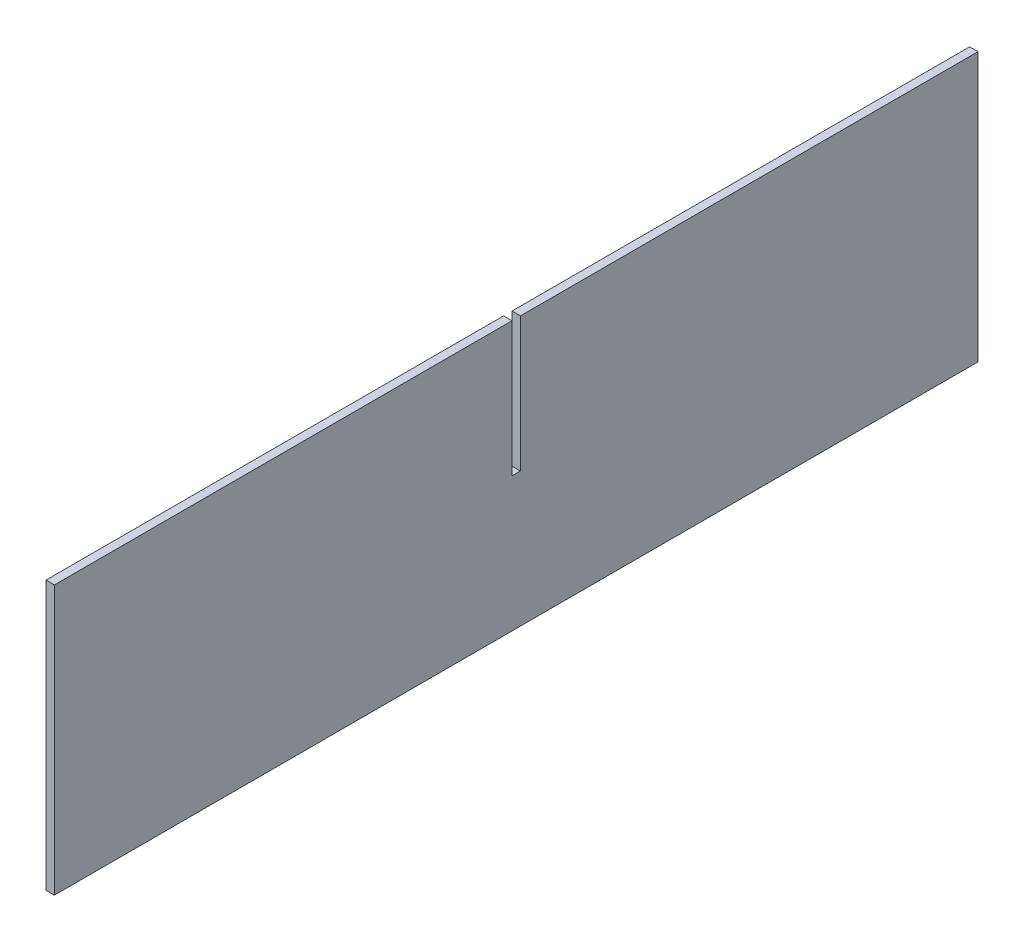
ISO-10303-21;
HEADER;
FILE_DESCRIPTION(('STEP AP214'),'2;1');
FILE_NAME('part.step','',(''),(''),'','','');
FILE_SCHEMA(('AUTOMOTIVE_DESIGN { 1 0 10303 214 1 1 1 1 }'));
ENDSEC;
DATA;
#1=APPLICATION_CONTEXT('core data for automotive mechanical design processes');
#2=APPLICATION_PROTOCOL_DEFINITION('international standard','automotive_design',2000,#1);
#3=PRODUCT_CONTEXT('',#1,'mechanical');
#4=PRODUCT('Part','Part','',(#3));
#5=PRODUCT_RELATED_PRODUCT_CATEGORY('part','',(#4));
#6=PRODUCT_DEFINITION_FORMATION('','',#4);
#7=PRODUCT_DEFINITION_CONTEXT('part definition',#1,'design');
#8=PRODUCT_DEFINITION('design','',#6,#7);
#9=PRODUCT_DEFINITION_SHAPE('','',#8);
#10=(LENGTH_UNIT() NAMED_UNIT(*) SI_UNIT(.MILLI.,.METRE.));
#11=(NAMED_UNIT(*) PLANE_ANGLE_UNIT() SI_UNIT($,.RADIAN.));
#12=(NAMED_UNIT(*) SI_UNIT($,.STERADIAN.) SOLID_ANGLE_UNIT());
#13=UNCERTAINTY_MEASURE_WITH_UNIT(LENGTH_MEASURE(1.E-05),#10,'distance_accuracy_value','');
#14=(GEOMETRIC_REPRESENTATION_CONTEXT(3) GLOBAL_UNCERTAINTY_ASSIGNED_CONTEXT((#13)) GLOBAL_UNIT_ASSIGNED_CONTEXT((#10,
#11,#12)) REPRESENTATION_CONTEXT('',''));
#15=CARTESIAN_POINT('',(0.,0.,0.));
#16=DIRECTION('',(0.,0.,1.));
#17=DIRECTION('',(1.,0.,0.));
#18=AXIS2_PLACEMENT_3D('',#15,#16,#17);
#19=CARTESIAN_POINT('',(1.25,40.,-1.24999999999999));
#20=DIRECTION('',(0.,-1.,0.));
#21=DIRECTION('',(0.,0.,-1.));
#22=AXIS2_PLACEMENT_3D('',#19,#20,#21);
#23=PLANE('',#22);
#24=DIRECTION('',(0.,0.,1.));
#25=VECTOR('',#24,1.);
#26=CARTESIAN_POINT('',(-1.25,40.,-1.24999999999999));
#27=LINE('',#26,#25);
#28=CARTESIAN_POINT('',(-1.25,40.,-137.5));
#29=VERTEX_POINT('',#28);
#30=CARTESIAN_POINT('',(-1.25,40.,-1.24999999999999));
#31=VERTEX_POINT('',#30);
#32=EDGE_CURVE('E132',#29,#31,#27,.T.);
#33=ORIENTED_EDGE('',*,*,#32,.T.);
#34=DIRECTION('',(-1.,0.,0.));
#35=VECTOR('',#34,1.);
#36=CARTESIAN_POINT('',(1.25,40.,-1.24999999999999));
#37=LINE('',#36,#35);
#38=CARTESIAN_POINT('',(1.25,40.,-1.24999999999999));
#39=VERTEX_POINT('',#38);
#40=EDGE_CURVE('E11',#39,#31,#37,.T.);
#41=ORIENTED_EDGE('',*,*,#40,.F.);
#42=DIRECTION('',(0.,0.,1.));
#43=VECTOR('',#42,1.);
#44=CARTESIAN_POINT('',(1.25,40.,-1.24999999999999));
#45=LINE('',#44,#43);
#46=CARTESIAN_POINT('',(1.25,40.,-137.5));
#47=VERTEX_POINT('',#46);
#48=EDGE_CURVE('E146',#47,#39,#45,.T.);
#49=ORIENTED_EDGE('',*,*,#48,.F.);
#50=DIRECTION('',(-1.,0.,0.));
#51=VECTOR('',#50,1.);
#52=CARTESIAN_POINT('',(1.25,40.,-137.5));
#53=LINE('',#52,#51);
#54=EDGE_CURVE('E128',#47,#29,#53,.T.);
#55=ORIENTED_EDGE('',*,*,#54,.T.);
#56=EDGE_LOOP('',(#33,#41,#49,#55));
#57=FACE_BOUND('',#56,.T.);
#58=ADVANCED_FACE('F36',(#57),#23,.F.);
#59=CARTESIAN_POINT('',(1.25,0.,-1.25));
#60=DIRECTION('',(0.,0.,-1.));
#61=DIRECTION('',(0.,1.,0.));
#62=AXIS2_PLACEMENT_3D('',#59,#60,#61);
#63=PLANE('',#62);
#64=DIRECTION('',(0.,-1.,0.));
#65=VECTOR('',#64,1.);
#66=CARTESIAN_POINT('',(-1.25,0.,-1.25));
#67=LINE('',#66,#65);
#68=CARTESIAN_POINT('',(-1.25,0.,-1.25));
#69=VERTEX_POINT('',#68);
#70=EDGE_CURVE('E135',#31,#69,#67,.T.);
#71=ORIENTED_EDGE('',*,*,#70,.T.);
#72=DIRECTION('',(-1.,0.,0.));
#73=VECTOR('',#72,1.);
#74=CARTESIAN_POINT('',(1.25,0.,-1.25));
#75=LINE('',#74,#73);
#76=CARTESIAN_POINT('',(1.25,0.,-1.25));
#77=VERTEX_POINT('',#76);
#78=EDGE_CURVE('E44',#77,#69,#75,.T.);
#79=ORIENTED_EDGE('',*,*,#78,.F.);
#80=DIRECTION('',(0.,-1.,0.));
#81=VECTOR('',#80,1.);
#82=CARTESIAN_POINT('',(1.25,0.,-1.25));
#83=LINE('',#82,#81);
#84=EDGE_CURVE('E95',#39,#77,#83,.T.);
#85=ORIENTED_EDGE('',*,*,#84,.F.);
#86=ORIENTED_EDGE('',*,*,#40,.T.);
#87=EDGE_LOOP('',(#71,#79,#85,#86));
#88=FACE_BOUND('',#87,.T.);
#89=ADVANCED_FACE('F181',(#88),#63,.F.);
#90=CARTESIAN_POINT('',(1.25,0.,1.25));
#91=DIRECTION('',(0.,-1.,0.));
#92=DIRECTION('',(0.,0.,-1.));
#93=AXIS2_PLACEMENT_3D('',#90,#91,#92);
#94=PLANE('',#93);
#95=DIRECTION('',(0.,0.,1.));
#96=VECTOR('',#95,1.);
#97=CARTESIAN_POINT('',(-1.25,0.,1.25));
#98=LINE('',#97,#96);
#99=CARTESIAN_POINT('',(-1.25,0.,1.25));
#100=VERTEX_POINT('',#99);
#101=EDGE_CURVE('E137',#69,#100,#98,.T.);
#102=ORIENTED_EDGE('',*,*,#101,.T.);
#103=DIRECTION('',(-1.,0.,0.));
#104=VECTOR('',#103,1.);
#105=CARTESIAN_POINT('',(1.25,0.,1.25));
#106=LINE('',#105,#104);
#107=CARTESIAN_POINT('',(1.25,0.,1.25));
#108=VERTEX_POINT('',#107);
#109=EDGE_CURVE('E153',#108,#100,#106,.T.);
#110=ORIENTED_EDGE('',*,*,#109,.F.);
#111=DIRECTION('',(0.,0.,1.));
#112=VECTOR('',#111,1.);
#113=CARTESIAN_POINT('',(1.25,0.,1.25));
#114=LINE('',#113,#112);
#115=EDGE_CURVE('E161',#77,#108,#114,.T.);
#116=ORIENTED_EDGE('',*,*,#115,.F.);
#117=ORIENTED_EDGE('',*,*,#78,.T.);
#118=EDGE_LOOP('',(#102,#110,#116,#117));
#119=FACE_BOUND('',#118,.T.);
#120=ADVANCED_FACE('F159',(#119),#94,.F.);
#121=CARTESIAN_POINT('',(1.25,0.,1.25));
#122=DIRECTION('',(0.,0.,1.));
#123=DIRECTION('',(1.,0.,0.));
#124=AXIS2_PLACEMENT_3D('',#121,#122,#123);
#125=PLANE('',#124);
#126=DIRECTION('',(0.,1.,0.));
#127=VECTOR('',#126,1.);
#128=CARTESIAN_POINT('',(-1.25,0.,1.25));
#129=LINE('',#128,#127);
#130=CARTESIAN_POINT('',(-1.25,40.,1.25));
#131=VERTEX_POINT('',#130);
#132=EDGE_CURVE('E139',#100,#131,#129,.T.);
#133=ORIENTED_EDGE('',*,*,#132,.T.);
#134=DIRECTION('',(-1.,0.,0.));
#135=VECTOR('',#134,1.);
#136=CARTESIAN_POINT('',(1.25,40.,1.25));
#137=LINE('',#136,#135);
#138=CARTESIAN_POINT('',(1.25,40.,1.25));
#139=VERTEX_POINT('',#138);
#140=EDGE_CURVE('E150',#139,#131,#137,.T.);
#141=ORIENTED_EDGE('',*,*,#140,.F.);
#142=DIRECTION('',(0.,1.,0.));
#143=VECTOR('',#142,1.);
#144=CARTESIAN_POINT('',(1.25,0.,1.25));
#145=LINE('',#144,#143);
#146=EDGE_CURVE('E173',#108,#139,#145,.T.);
#147=ORIENTED_EDGE('',*,*,#146,.F.);
#148=ORIENTED_EDGE('',*,*,#109,.T.);
#149=EDGE_LOOP('',(#133,#141,#147,#148));
#150=FACE_BOUND('',#149,.T.);
#151=ADVANCED_FACE('F169',(#150),#125,.F.);
#152=CARTESIAN_POINT('',(1.25,40.,137.5));
#153=DIRECTION('',(0.,-1.,0.));
#154=DIRECTION('',(0.,0.,-1.));
#155=AXIS2_PLACEMENT_3D('',#152,#153,#154);
#156=PLANE('',#155);
#157=DIRECTION('',(0.,0.,1.));
#158=VECTOR('',#157,1.);
#159=CARTESIAN_POINT('',(-1.25,40.,137.5));
#160=LINE('',#159,#158);
#161=CARTESIAN_POINT('',(-1.25,40.,137.5));
#162=VERTEX_POINT('',#161);
#163=EDGE_CURVE('E141',#131,#162,#160,.T.);
#164=ORIENTED_EDGE('',*,*,#163,.T.);
#165=DIRECTION('',(-1.,0.,0.));
#166=VECTOR('',#165,1.);
#167=CARTESIAN_POINT('',(1.25,40.,137.5));
#168=LINE('',#167,#166);
#169=CARTESIAN_POINT('',(1.25,40.,137.5));
#170=VERTEX_POINT('',#169);
#171=EDGE_CURVE('E123',#170,#162,#168,.T.);
#172=ORIENTED_EDGE('',*,*,#171,.F.);
#173=DIRECTION('',(0.,0.,1.));
#174=VECTOR('',#173,1.);
#175=CARTESIAN_POINT('',(1.25,40.,137.5));
#176=LINE('',#175,#174);
#177=EDGE_CURVE('E114',#139,#170,#176,.T.);
#178=ORIENTED_EDGE('',*,*,#177,.F.);
#179=ORIENTED_EDGE('',*,*,#140,.T.);
#180=EDGE_LOOP('',(#164,#172,#178,#179));
#181=FACE_BOUND('',#180,.T.);
#182=ADVANCED_FACE('F172',(#181),#156,.F.);
#183=CARTESIAN_POINT('',(1.25,-40.,137.5));
#184=DIRECTION('',(0.,0.,-1.));
#185=DIRECTION('',(-1.,0.,0.));
#186=AXIS2_PLACEMENT_3D('',#183,#184,#185);
#187=PLANE('',#186);
#188=DIRECTION('',(0.,-1.,0.));
#189=VECTOR('',#188,1.);
#190=CARTESIAN_POINT('',(-1.25,-40.,137.5));
#191=LINE('',#190,#189);
#192=CARTESIAN_POINT('',(-1.25,-40.,137.5));
#193=VERTEX_POINT('',#192);
#194=EDGE_CURVE('E122',#162,#193,#191,.T.);
#195=ORIENTED_EDGE('',*,*,#194,.T.);
#196=DIRECTION('',(-1.,0.,0.));
#197=VECTOR('',#196,1.);
#198=CARTESIAN_POINT('',(1.25,-40.,137.5));
#199=LINE('',#198,#197);
#200=CARTESIAN_POINT('',(1.25,-40.,137.5));
#201=VERTEX_POINT('',#200);
#202=EDGE_CURVE('E119',#201,#193,#199,.T.);
#203=ORIENTED_EDGE('',*,*,#202,.F.);
#204=DIRECTION('',(0.,-1.,0.));
#205=VECTOR('',#204,1.);
#206=CARTESIAN_POINT('',(1.25,-40.,137.5));
#207=LINE('',#206,#205);
#208=EDGE_CURVE('E108',#170,#201,#207,.T.);
#209=ORIENTED_EDGE('',*,*,#208,.F.);
#210=ORIENTED_EDGE('',*,*,#171,.T.);
#211=EDGE_LOOP('',(#195,#203,#209,#210));
#212=FACE_BOUND('',#211,.T.);
#213=ADVANCED_FACE('F120',(#212),#187,.F.);
#214=CARTESIAN_POINT('',(1.25,-40.,137.5));
#215=DIRECTION('',(0.,1.,0.));
#216=DIRECTION('',(0.,0.,1.));
#217=AXIS2_PLACEMENT_3D('',#214,#215,#216);
#218=PLANE('',#217);
#219=DIRECTION('',(0.,0.,-1.));
#220=VECTOR('',#219,1.);
#221=CARTESIAN_POINT('',(-1.25,-40.,137.5));
#222=LINE('',#221,#220);
#223=CARTESIAN_POINT('',(-1.25,-40.,-137.5));
#224=VERTEX_POINT('',#223);
#225=EDGE_CURVE('E81',#193,#224,#222,.T.);
#226=ORIENTED_EDGE('',*,*,#225,.T.);
#227=DIRECTION('',(-1.,0.,0.));
#228=VECTOR('',#227,1.);
#229=CARTESIAN_POINT('',(1.25,-40.,-137.5));
#230=LINE('',#229,#228);
#231=CARTESIAN_POINT('',(1.25,-40.,-137.5));
#232=VERTEX_POINT('',#231);
#233=EDGE_CURVE('E124',#232,#224,#230,.T.);
#234=ORIENTED_EDGE('',*,*,#233,.F.);
#235=DIRECTION('',(0.,0.,-1.));
#236=VECTOR('',#235,1.);
#237=CARTESIAN_POINT('',(1.25,-40.,137.5));
#238=LINE('',#237,#236);
#239=EDGE_CURVE('E112',#201,#232,#238,.T.);
#240=ORIENTED_EDGE('',*,*,#239,.F.);
#241=ORIENTED_EDGE('',*,*,#202,.T.);
#242=EDGE_LOOP('',(#226,#234,#240,#241));
#243=FACE_BOUND('',#242,.T.);
#244=ADVANCED_FACE('F126',(#243),#218,.F.);
#245=CARTESIAN_POINT('',(1.25,-40.,-137.5));
#246=DIRECTION('',(0.,0.,1.));
#247=DIRECTION('',(1.,0.,0.));
#248=AXIS2_PLACEMENT_3D('',#245,#246,#247);
#249=PLANE('',#248);
#250=DIRECTION('',(0.,1.,0.));
#251=VECTOR('',#250,1.);
#252=CARTESIAN_POINT('',(-1.25,-40.,-137.5));
#253=LINE('',#252,#251);
#254=EDGE_CURVE('E87',#224,#29,#253,.T.);
#255=ORIENTED_EDGE('',*,*,#254,.T.);
#256=ORIENTED_EDGE('',*,*,#54,.F.);
#257=DIRECTION('',(0.,1.,0.));
#258=VECTOR('',#257,1.);
#259=CARTESIAN_POINT('',(1.25,-40.,-137.5));
#260=LINE('',#259,#258);
#261=EDGE_CURVE('E52',#232,#47,#260,.T.);
#262=ORIENTED_EDGE('',*,*,#261,.F.);
#263=ORIENTED_EDGE('',*,*,#233,.T.);
#264=EDGE_LOOP('',(#255,#256,#262,#263));
#265=FACE_BOUND('',#264,.T.);
#266=ADVANCED_FACE('F197',(#265),#249,.F.);
#267=CARTESIAN_POINT('',(1.25,0.,0.));
#268=DIRECTION('',(1.,0.,0.));
#269=DIRECTION('',(0.,0.,-1.));
#270=AXIS2_PLACEMENT_3D('',#267,#268,#269);
#271=PLANE('',#270);
#272=ORIENTED_EDGE('',*,*,#48,.T.);
#273=ORIENTED_EDGE('',*,*,#84,.T.);
#274=ORIENTED_EDGE('',*,*,#115,.T.);
#275=ORIENTED_EDGE('',*,*,#146,.T.);
#276=ORIENTED_EDGE('',*,*,#177,.T.);
#277=ORIENTED_EDGE('',*,*,#208,.T.);
#278=ORIENTED_EDGE('',*,*,#239,.T.);
#279=ORIENTED_EDGE('',*,*,#261,.T.);
#280=EDGE_LOOP('',(#272,#273,#274,#275,#276,#277,#278,#279));
#281=FACE_BOUND('',#280,.T.);
#282=ADVANCED_FACE('F110',(#281),#271,.T.);
#283=CARTESIAN_POINT('',(-1.25,0.,0.));
#284=DIRECTION('',(1.,0.,0.));
#285=DIRECTION('',(0.,0.,-1.));
#286=AXIS2_PLACEMENT_3D('',#283,#284,#285);
#287=PLANE('',#286);
#288=ORIENTED_EDGE('',*,*,#32,.F.);
#289=ORIENTED_EDGE('',*,*,#254,.F.);
#290=ORIENTED_EDGE('',*,*,#225,.F.);
#291=ORIENTED_EDGE('',*,*,#194,.F.);
#292=ORIENTED_EDGE('',*,*,#163,.F.);
#293=ORIENTED_EDGE('',*,*,#132,.F.);
#294=ORIENTED_EDGE('',*,*,#101,.F.);
#295=ORIENTED_EDGE('',*,*,#70,.F.);
#296=EDGE_LOOP('',(#288,#289,#290,#291,#292,#293,#294,#295));
#297=FACE_BOUND('',#296,.T.);
#298=ADVANCED_FACE('F165',(#297),#287,.F.);
#299=CLOSED_SHELL('',(#58,#89,#120,#151,#182,#213,#244,#266,#282,#298));
#300=MANIFOLD_SOLID_BREP('B2',#299);
#301=ADVANCED_BREP_SHAPE_REPRESENTATION('',(#18,#300),#14);
#302=SHAPE_DEFINITION_REPRESENTATION(#9,#301);
ENDSEC;
END-ISO-10303-21;
